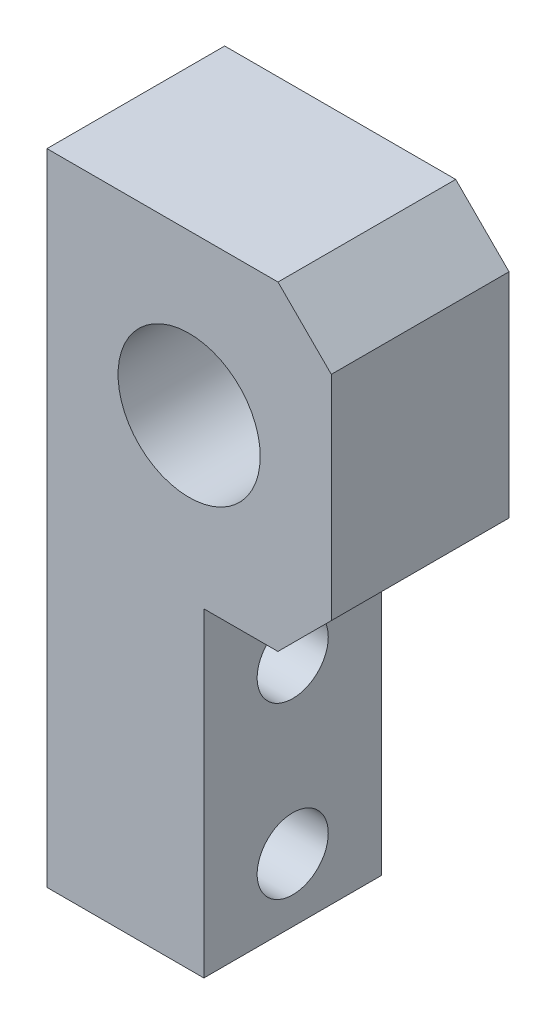
ISO-10303-21;
HEADER;
FILE_DESCRIPTION(('STEP AP214'),'2;1');
FILE_NAME('part.step','',(''),(''),'','','');
FILE_SCHEMA(('AUTOMOTIVE_DESIGN { 1 0 10303 214 1 1 1 1 }'));
ENDSEC;
DATA;
#1=APPLICATION_CONTEXT('core data for automotive mechanical design processes');
#2=APPLICATION_PROTOCOL_DEFINITION('international standard','automotive_design',2000,#1);
#3=PRODUCT_CONTEXT('',#1,'mechanical');
#4=PRODUCT('Part','Part','',(#3));
#5=PRODUCT_RELATED_PRODUCT_CATEGORY('part','',(#4));
#6=PRODUCT_DEFINITION_FORMATION('','',#4);
#7=PRODUCT_DEFINITION_CONTEXT('part definition',#1,'design');
#8=PRODUCT_DEFINITION('design','',#6,#7);
#9=PRODUCT_DEFINITION_SHAPE('','',#8);
#10=(LENGTH_UNIT() NAMED_UNIT(*) SI_UNIT(.MILLI.,.METRE.));
#11=(NAMED_UNIT(*) PLANE_ANGLE_UNIT() SI_UNIT($,.RADIAN.));
#12=(NAMED_UNIT(*) SI_UNIT($,.STERADIAN.) SOLID_ANGLE_UNIT());
#13=UNCERTAINTY_MEASURE_WITH_UNIT(LENGTH_MEASURE(1.E-05),#10,'distance_accuracy_value','');
#14=(GEOMETRIC_REPRESENTATION_CONTEXT(3) GLOBAL_UNCERTAINTY_ASSIGNED_CONTEXT((#13)) GLOBAL_UNIT_ASSIGNED_CONTEXT((#10,
#11,#12)) REPRESENTATION_CONTEXT('',''));
#15=CARTESIAN_POINT('',(0.,0.,0.));
#16=DIRECTION('',(0.,0.,1.));
#17=DIRECTION('',(1.,0.,0.));
#18=AXIS2_PLACEMENT_3D('',#15,#16,#17);
#19=CARTESIAN_POINT('',(16.,-22.6305555757172,10.));
#20=DIRECTION('',(0.,0.,1.));
#21=DIRECTION('',(0.,-1.,0.));
#22=AXIS2_PLACEMENT_3D('',#19,#20,#21);
#23=PLANE('',#22);
#24=CARTESIAN_POINT('',(8.,-31.6305555757172,10.));
#25=DIRECTION('',(0.,0.,1.));
#26=DIRECTION('',(1.,0.,0.));
#27=AXIS2_PLACEMENT_3D('',#24,#25,#26);
#28=CIRCLE('',#27,4.00000000104675);
#29=CARTESIAN_POINT('',(12.0000000010467,-31.6305555757172,10.));
#30=VERTEX_POINT('',#29);
#31=EDGE_CURVE('E126',#30,#30,#28,.T.);
#32=ORIENTED_EDGE('',*,*,#31,.T.);
#33=EDGE_LOOP('',(#32));
#34=FACE_BOUND('',#33,.T.);
#35=DIRECTION('',(0.,1.,0.));
#36=VECTOR('',#35,1.);
#37=CARTESIAN_POINT('',(16.,-22.6305555757172,10.));
#38=LINE('',#37,#36);
#39=CARTESIAN_POINT('',(16.,-37.6305555757172,10.));
#40=VERTEX_POINT('',#39);
#41=CARTESIAN_POINT('',(16.,-25.6305555757172,10.));
#42=VERTEX_POINT('',#41);
#43=EDGE_CURVE('E132',#40,#42,#38,.T.);
#44=ORIENTED_EDGE('',*,*,#43,.F.);
#45=DIRECTION('',(-0.707106781186548,-0.707106781186548,0.));
#46=VECTOR('',#45,1.);
#47=CARTESIAN_POINT('',(12.9961705364393,-40.6343850392778,10.));
#48=LINE('',#47,#46);
#49=CARTESIAN_POINT('',(12.9961705364393,-40.6343850392778,10.));
#50=VERTEX_POINT('',#49);
#51=EDGE_CURVE('E40',#40,#50,#48,.T.);
#52=ORIENTED_EDGE('',*,*,#51,.T.);
#53=DIRECTION('',(-0.999999187366331,-0.00127485947360116,0.));
#54=VECTOR('',#53,1.);
#55=CARTESIAN_POINT('',(16.,-40.6305555757172,10.));
#56=LINE('',#55,#54);
#57=CARTESIAN_POINT('',(8.82861320662202,-40.6396980935391,10.));
#58=VERTEX_POINT('',#57);
#59=EDGE_CURVE('E96',#50,#58,#56,.T.);
#60=ORIENTED_EDGE('',*,*,#59,.T.);
#61=DIRECTION('',(0.,-1.,0.));
#62=VECTOR('',#61,1.);
#63=CARTESIAN_POINT('',(8.82861320662202,-40.6396980935391,10.));
#64=LINE('',#63,#62);
#65=CARTESIAN_POINT('',(8.82861320662203,-58.6305555757172,10.));
#66=VERTEX_POINT('',#65);
#67=EDGE_CURVE('E99',#58,#66,#64,.T.);
#68=ORIENTED_EDGE('',*,*,#67,.T.);
#69=DIRECTION('',(-1.,0.,0.));
#70=VECTOR('',#69,1.);
#71=CARTESIAN_POINT('',(16.,-58.6305555757172,10.));
#72=LINE('',#71,#70);
#73=CARTESIAN_POINT('',(0.,-58.6305555757172,10.));
#74=VERTEX_POINT('',#73);
#75=EDGE_CURVE('E138',#66,#74,#72,.T.);
#76=ORIENTED_EDGE('',*,*,#75,.T.);
#77=DIRECTION('',(0.,1.,0.));
#78=VECTOR('',#77,1.);
#79=CARTESIAN_POINT('',(0.,-22.6305555757172,10.));
#80=LINE('',#79,#78);
#81=CARTESIAN_POINT('',(0.,-22.6305555757172,10.));
#82=VERTEX_POINT('',#81);
#83=EDGE_CURVE('E129',#74,#82,#80,.T.);
#84=ORIENTED_EDGE('',*,*,#83,.T.);
#85=DIRECTION('',(-1.,0.,0.));
#86=VECTOR('',#85,1.);
#87=CARTESIAN_POINT('',(16.,-22.6305555757172,10.));
#88=LINE('',#87,#86);
#89=CARTESIAN_POINT('',(13.,-22.6305555757172,10.));
#90=VERTEX_POINT('',#89);
#91=EDGE_CURVE('E154',#90,#82,#88,.T.);
#92=ORIENTED_EDGE('',*,*,#91,.F.);
#93=DIRECTION('',(0.707106781186549,-0.707106781186546,0.));
#94=VECTOR('',#93,1.);
#95=CARTESIAN_POINT('',(16.,-25.6305555757172,10.));
#96=LINE('',#95,#94);
#97=EDGE_CURVE('E52',#90,#42,#96,.T.);
#98=ORIENTED_EDGE('',*,*,#97,.T.);
#99=EDGE_LOOP('',(#44,#52,#60,#68,#76,#84,#92,#98));
#100=FACE_BOUND('',#99,.T.);
#101=ADVANCED_FACE('F32',(#34,#100),#23,.F.);
#102=CARTESIAN_POINT('',(16.,-22.6305555757172,20.));
#103=DIRECTION('',(0.,-1.,0.));
#104=DIRECTION('',(0.,0.,-1.));
#105=AXIS2_PLACEMENT_3D('',#102,#103,#104);
#106=PLANE('',#105);
#107=DIRECTION('',(-1.,0.,0.));
#108=VECTOR('',#107,1.);
#109=CARTESIAN_POINT('',(16.,-22.6305555757172,20.));
#110=LINE('',#109,#108);
#111=CARTESIAN_POINT('',(13.,-22.6305555757172,20.));
#112=VERTEX_POINT('',#111);
#113=CARTESIAN_POINT('',(0.,-22.6305555757172,20.));
#114=VERTEX_POINT('',#113);
#115=EDGE_CURVE('E152',#112,#114,#110,.T.);
#116=ORIENTED_EDGE('',*,*,#115,.F.);
#117=DIRECTION('',(0.,0.,-1.));
#118=VECTOR('',#117,1.);
#119=CARTESIAN_POINT('',(13.,-22.6305555757172,10.));
#120=LINE('',#119,#118);
#121=EDGE_CURVE('E11',#112,#90,#120,.T.);
#122=ORIENTED_EDGE('',*,*,#121,.T.);
#123=ORIENTED_EDGE('',*,*,#91,.T.);
#124=DIRECTION('',(0.,0.,1.));
#125=VECTOR('',#124,1.);
#126=CARTESIAN_POINT('',(0.,-22.6305555757172,20.));
#127=LINE('',#126,#125);
#128=EDGE_CURVE('E141',#82,#114,#127,.T.);
#129=ORIENTED_EDGE('',*,*,#128,.T.);
#130=EDGE_LOOP('',(#116,#122,#123,#129));
#131=FACE_BOUND('',#130,.T.);
#132=ADVANCED_FACE('F185',(#131),#106,.F.);
#133=CARTESIAN_POINT('',(16.,-22.6305555757172,20.));
#134=DIRECTION('',(0.,0.,-1.));
#135=DIRECTION('',(0.,1.,0.));
#136=AXIS2_PLACEMENT_3D('',#133,#134,#135);
#137=PLANE('',#136);
#138=CARTESIAN_POINT('',(8.,-31.6305555757172,20.));
#139=DIRECTION('',(0.,0.,1.));
#140=DIRECTION('',(1.,0.,0.));
#141=AXIS2_PLACEMENT_3D('',#138,#139,#140);
#142=CIRCLE('',#141,4.00000000104675);
#143=CARTESIAN_POINT('',(12.0000000010467,-31.6305555757172,20.));
#144=VERTEX_POINT('',#143);
#145=EDGE_CURVE('E124',#144,#144,#142,.T.);
#146=ORIENTED_EDGE('',*,*,#145,.F.);
#147=EDGE_LOOP('',(#146));
#148=FACE_BOUND('',#147,.T.);
#149=DIRECTION('',(-0.999999187366331,-0.00127485947360116,0.));
#150=VECTOR('',#149,1.);
#151=CARTESIAN_POINT('',(16.,-40.6305555757172,20.));
#152=LINE('',#151,#150);
#153=CARTESIAN_POINT('',(12.9961705364393,-40.6343850392778,20.));
#154=VERTEX_POINT('',#153);
#155=CARTESIAN_POINT('',(8.82861320662202,-40.6396980935391,20.));
#156=VERTEX_POINT('',#155);
#157=EDGE_CURVE('E111',#154,#156,#152,.T.);
#158=ORIENTED_EDGE('',*,*,#157,.F.);
#159=DIRECTION('',(0.707106781186548,0.707106781186548,0.));
#160=VECTOR('',#159,1.);
#161=CARTESIAN_POINT('',(12.9961705364393,-40.6343850392778,20.));
#162=LINE('',#161,#160);
#163=CARTESIAN_POINT('',(16.,-37.6305555757172,20.));
#164=VERTEX_POINT('',#163);
#165=EDGE_CURVE('E160',#154,#164,#162,.T.);
#166=ORIENTED_EDGE('',*,*,#165,.T.);
#167=DIRECTION('',(0.,-1.,0.));
#168=VECTOR('',#167,1.);
#169=CARTESIAN_POINT('',(16.,-22.6305555757172,20.));
#170=LINE('',#169,#168);
#171=CARTESIAN_POINT('',(16.,-25.6305555757172,20.));
#172=VERTEX_POINT('',#171);
#173=EDGE_CURVE('E134',#172,#164,#170,.T.);
#174=ORIENTED_EDGE('',*,*,#173,.F.);
#175=DIRECTION('',(-0.707106781186549,0.707106781186546,0.));
#176=VECTOR('',#175,1.);
#177=CARTESIAN_POINT('',(16.,-25.6305555757172,20.));
#178=LINE('',#177,#176);
#179=EDGE_CURVE('E158',#172,#112,#178,.T.);
#180=ORIENTED_EDGE('',*,*,#179,.T.);
#181=ORIENTED_EDGE('',*,*,#115,.T.);
#182=DIRECTION('',(0.,-1.,0.));
#183=VECTOR('',#182,1.);
#184=CARTESIAN_POINT('',(0.,-22.6305555757172,20.));
#185=LINE('',#184,#183);
#186=CARTESIAN_POINT('',(0.,-58.6305555757172,20.));
#187=VERTEX_POINT('',#186);
#188=EDGE_CURVE('E144',#114,#187,#185,.T.);
#189=ORIENTED_EDGE('',*,*,#188,.T.);
#190=DIRECTION('',(-1.,0.,0.));
#191=VECTOR('',#190,1.);
#192=CARTESIAN_POINT('',(16.,-58.6305555757172,20.));
#193=LINE('',#192,#191);
#194=CARTESIAN_POINT('',(8.82861320662203,-58.6305555757172,20.));
#195=VERTEX_POINT('',#194);
#196=EDGE_CURVE('E150',#195,#187,#193,.T.);
#197=ORIENTED_EDGE('',*,*,#196,.F.);
#198=DIRECTION('',(0.,-1.,0.));
#199=VECTOR('',#198,1.);
#200=CARTESIAN_POINT('',(8.82861320662202,-40.6396980935391,20.));
#201=LINE('',#200,#199);
#202=EDGE_CURVE('E105',#156,#195,#201,.T.);
#203=ORIENTED_EDGE('',*,*,#202,.F.);
#204=EDGE_LOOP('',(#158,#166,#174,#180,#181,#189,#197,#203));
#205=FACE_BOUND('',#204,.T.);
#206=ADVANCED_FACE('F175',(#148,#205),#137,.F.);
#207=CARTESIAN_POINT('',(16.,-58.6305555757172,20.));
#208=DIRECTION('',(0.,1.,0.));
#209=DIRECTION('',(0.,0.,1.));
#210=AXIS2_PLACEMENT_3D('',#207,#208,#209);
#211=PLANE('',#210);
#212=ORIENTED_EDGE('',*,*,#75,.F.);
#213=DIRECTION('',(0.,0.,1.));
#214=VECTOR('',#213,1.);
#215=CARTESIAN_POINT('',(8.82861320662203,-58.6305555757172,10.));
#216=LINE('',#215,#214);
#217=EDGE_CURVE('E114',#66,#195,#216,.T.);
#218=ORIENTED_EDGE('',*,*,#217,.T.);
#219=ORIENTED_EDGE('',*,*,#196,.T.);
#220=DIRECTION('',(0.,0.,-1.));
#221=VECTOR('',#220,1.);
#222=CARTESIAN_POINT('',(0.,-58.6305555757172,20.));
#223=LINE('',#222,#221);
#224=EDGE_CURVE('E135',#187,#74,#223,.T.);
#225=ORIENTED_EDGE('',*,*,#224,.T.);
#226=EDGE_LOOP('',(#212,#218,#219,#225));
#227=FACE_BOUND('',#226,.T.);
#228=ADVANCED_FACE('F178',(#227),#211,.F.);
#229=CARTESIAN_POINT('',(16.,-58.6305555757172,10.));
#230=DIRECTION('',(1.,0.,0.));
#231=DIRECTION('',(0.,0.,-1.));
#232=AXIS2_PLACEMENT_3D('',#229,#230,#231);
#233=PLANE('',#232);
#234=ORIENTED_EDGE('',*,*,#173,.T.);
#235=DIRECTION('',(0.,0.,-1.));
#236=VECTOR('',#235,1.);
#237=CARTESIAN_POINT('',(16.,-37.6305555757172,10.));
#238=LINE('',#237,#236);
#239=EDGE_CURVE('E165',#164,#40,#238,.T.);
#240=ORIENTED_EDGE('',*,*,#239,.T.);
#241=ORIENTED_EDGE('',*,*,#43,.T.);
#242=DIRECTION('',(0.,0.,1.));
#243=VECTOR('',#242,1.);
#244=CARTESIAN_POINT('',(16.,-25.6305555757172,20.));
#245=LINE('',#244,#243);
#246=EDGE_CURVE('E162',#42,#172,#245,.T.);
#247=ORIENTED_EDGE('',*,*,#246,.T.);
#248=EDGE_LOOP('',(#234,#240,#241,#247));
#249=FACE_BOUND('',#248,.T.);
#250=ADVANCED_FACE('F169',(#249),#233,.T.);
#251=CARTESIAN_POINT('',(0.,-58.6305555757172,10.));
#252=DIRECTION('',(1.,0.,0.));
#253=DIRECTION('',(0.,0.,-1.));
#254=AXIS2_PLACEMENT_3D('',#251,#252,#253);
#255=PLANE('',#254);
#256=CARTESIAN_POINT('',(0.,-45.5132823454676,15.));
#257=DIRECTION('',(1.,0.,0.));
#258=DIRECTION('',(0.,0.,-1.));
#259=AXIS2_PLACEMENT_3D('',#256,#257,#258);
#260=CIRCLE('',#259,2.);
#261=CARTESIAN_POINT('',(0.,-45.5132823454676,13.));
#262=VERTEX_POINT('',#261);
#263=EDGE_CURVE('E230',#262,#262,#260,.T.);
#264=ORIENTED_EDGE('',*,*,#263,.T.);
#265=EDGE_LOOP('',(#264));
#266=FACE_BOUND('',#265,.T.);
#267=CARTESIAN_POINT('',(0.,-55.0758180255181,15.));
#268=DIRECTION('',(1.,0.,0.));
#269=DIRECTION('',(0.,0.,-1.));
#270=AXIS2_PLACEMENT_3D('',#267,#268,#269);
#271=CIRCLE('',#270,2.);
#272=CARTESIAN_POINT('',(0.,-55.0758180255181,13.));
#273=VERTEX_POINT('',#272);
#274=EDGE_CURVE('E122',#273,#273,#271,.T.);
#275=ORIENTED_EDGE('',*,*,#274,.T.);
#276=EDGE_LOOP('',(#275));
#277=FACE_BOUND('',#276,.T.);
#278=ORIENTED_EDGE('',*,*,#83,.F.);
#279=ORIENTED_EDGE('',*,*,#224,.F.);
#280=ORIENTED_EDGE('',*,*,#188,.F.);
#281=ORIENTED_EDGE('',*,*,#128,.F.);
#282=EDGE_LOOP('',(#278,#279,#280,#281));
#283=FACE_BOUND('',#282,.T.);
#284=ADVANCED_FACE('F183',(#266,#277,#283),#255,.F.);
#285=CARTESIAN_POINT('',(8.,-31.6305555757172,10.));
#286=DIRECTION('',(0.,0.,1.));
#287=DIRECTION('',(1.,0.,0.));
#288=AXIS2_PLACEMENT_3D('',#285,#286,#287);
#289=CYLINDRICAL_SURFACE('',#288,4.00000000104675);
#290=ORIENTED_EDGE('',*,*,#31,.F.);
#291=EDGE_LOOP('',(#290));
#292=FACE_BOUND('',#291,.T.);
#293=ORIENTED_EDGE('',*,*,#145,.T.);
#294=EDGE_LOOP('',(#293));
#295=FACE_BOUND('',#294,.T.);
#296=ADVANCED_FACE('F211',(#292,#295),#289,.F.);
#297=CARTESIAN_POINT('',(16.,-40.6305555757172,10.));
#298=DIRECTION('',(-0.00127485947360116,0.999999187366331,0.));
#299=DIRECTION('',(-0.999999187366331,-0.00127485947360116,0.));
#300=AXIS2_PLACEMENT_3D('',#297,#298,#299);
#301=PLANE('',#300);
#302=ORIENTED_EDGE('',*,*,#59,.F.);
#303=DIRECTION('',(0.,0.,1.));
#304=VECTOR('',#303,1.);
#305=CARTESIAN_POINT('',(12.9961705364393,-40.6343850392778,20.));
#306=LINE('',#305,#304);
#307=EDGE_CURVE('E156',#50,#154,#306,.T.);
#308=ORIENTED_EDGE('',*,*,#307,.T.);
#309=ORIENTED_EDGE('',*,*,#157,.T.);
#310=DIRECTION('',(0.,0.,1.));
#311=VECTOR('',#310,1.);
#312=CARTESIAN_POINT('',(8.82861320662202,-40.6396980935391,10.));
#313=LINE('',#312,#311);
#314=EDGE_CURVE('E108',#58,#156,#313,.T.);
#315=ORIENTED_EDGE('',*,*,#314,.F.);
#316=EDGE_LOOP('',(#302,#308,#309,#315));
#317=FACE_BOUND('',#316,.T.);
#318=ADVANCED_FACE('F109',(#317),#301,.F.);
#319=CARTESIAN_POINT('',(8.82861320662202,-40.6396980935391,10.));
#320=DIRECTION('',(-1.,0.,0.));
#321=DIRECTION('',(0.,-1.,0.));
#322=AXIS2_PLACEMENT_3D('',#319,#320,#321);
#323=PLANE('',#322);
#324=CARTESIAN_POINT('',(8.82861320662199,-45.5132823454676,15.));
#325=DIRECTION('',(1.,0.,0.));
#326=DIRECTION('',(0.,0.,-1.));
#327=AXIS2_PLACEMENT_3D('',#324,#325,#326);
#328=CIRCLE('',#327,2.);
#329=CARTESIAN_POINT('',(8.82861320662199,-45.5132823454676,13.));
#330=VERTEX_POINT('',#329);
#331=EDGE_CURVE('E233',#330,#330,#328,.T.);
#332=ORIENTED_EDGE('',*,*,#331,.F.);
#333=EDGE_LOOP('',(#332));
#334=FACE_BOUND('',#333,.T.);
#335=CARTESIAN_POINT('',(8.82861320662199,-55.0758180255181,15.));
#336=DIRECTION('',(1.,0.,0.));
#337=DIRECTION('',(0.,0.,-1.));
#338=AXIS2_PLACEMENT_3D('',#335,#336,#337);
#339=CIRCLE('',#338,2.);
#340=CARTESIAN_POINT('',(8.82861320662199,-55.0758180255181,13.));
#341=VERTEX_POINT('',#340);
#342=EDGE_CURVE('E235',#341,#341,#339,.T.);
#343=ORIENTED_EDGE('',*,*,#342,.F.);
#344=EDGE_LOOP('',(#343));
#345=FACE_BOUND('',#344,.T.);
#346=ORIENTED_EDGE('',*,*,#202,.T.);
#347=ORIENTED_EDGE('',*,*,#217,.F.);
#348=ORIENTED_EDGE('',*,*,#67,.F.);
#349=ORIENTED_EDGE('',*,*,#314,.T.);
#350=EDGE_LOOP('',(#346,#347,#348,#349));
#351=FACE_BOUND('',#350,.T.);
#352=ADVANCED_FACE('F116',(#334,#345,#351),#323,.F.);
#353=CARTESIAN_POINT('',(12.9961705364393,-40.6343850392778,10.));
#354=DIRECTION('',(0.707106781186548,-0.707106781186548,0.));
#355=DIRECTION('',(0.707106781186548,0.707106781186548,0.));
#356=AXIS2_PLACEMENT_3D('',#353,#354,#355);
#357=PLANE('',#356);
#358=ORIENTED_EDGE('',*,*,#51,.F.);
#359=ORIENTED_EDGE('',*,*,#239,.F.);
#360=ORIENTED_EDGE('',*,*,#165,.F.);
#361=ORIENTED_EDGE('',*,*,#307,.F.);
#362=EDGE_LOOP('',(#358,#359,#360,#361));
#363=FACE_BOUND('',#362,.T.);
#364=ADVANCED_FACE('F173',(#363),#357,.T.);
#365=CARTESIAN_POINT('',(16.,-25.6305555757172,10.));
#366=DIRECTION('',(0.707106781186546,0.707106781186549,0.));
#367=DIRECTION('',(-0.707106781186549,0.707106781186546,0.));
#368=AXIS2_PLACEMENT_3D('',#365,#366,#367);
#369=PLANE('',#368);
#370=ORIENTED_EDGE('',*,*,#97,.F.);
#371=ORIENTED_EDGE('',*,*,#121,.F.);
#372=ORIENTED_EDGE('',*,*,#179,.F.);
#373=ORIENTED_EDGE('',*,*,#246,.F.);
#374=EDGE_LOOP('',(#370,#371,#372,#373));
#375=FACE_BOUND('',#374,.T.);
#376=ADVANCED_FACE('F34',(#375),#369,.T.);
#377=CARTESIAN_POINT('',(0.,-55.0758180255181,15.));
#378=DIRECTION('',(1.,0.,0.));
#379=DIRECTION('',(0.,0.,-1.));
#380=AXIS2_PLACEMENT_3D('',#377,#378,#379);
#381=CYLINDRICAL_SURFACE('',#380,2.);
#382=ORIENTED_EDGE('',*,*,#274,.F.);
#383=EDGE_LOOP('',(#382));
#384=FACE_BOUND('',#383,.T.);
#385=ORIENTED_EDGE('',*,*,#342,.T.);
#386=EDGE_LOOP('',(#385));
#387=FACE_BOUND('',#386,.T.);
#388=ADVANCED_FACE('F188',(#384,#387),#381,.F.);
#389=CARTESIAN_POINT('',(0.,-45.5132823454676,15.));
#390=DIRECTION('',(1.,0.,0.));
#391=DIRECTION('',(0.,0.,-1.));
#392=AXIS2_PLACEMENT_3D('',#389,#390,#391);
#393=CYLINDRICAL_SURFACE('',#392,2.);
#394=ORIENTED_EDGE('',*,*,#263,.F.);
#395=EDGE_LOOP('',(#394));
#396=FACE_BOUND('',#395,.T.);
#397=ORIENTED_EDGE('',*,*,#331,.T.);
#398=EDGE_LOOP('',(#397));
#399=FACE_BOUND('',#398,.T.);
#400=ADVANCED_FACE('F193',(#396,#399),#393,.F.);
#401=CLOSED_SHELL('',(#101,#132,#206,#228,#250,#284,#296,#318,#352,#364,#376,#388,#400));
#402=MANIFOLD_SOLID_BREP('B2',#401);
#403=ADVANCED_BREP_SHAPE_REPRESENTATION('',(#18,#402),#14);
#404=SHAPE_DEFINITION_REPRESENTATION(#9,#403);
ENDSEC;
END-ISO-10303-21;
